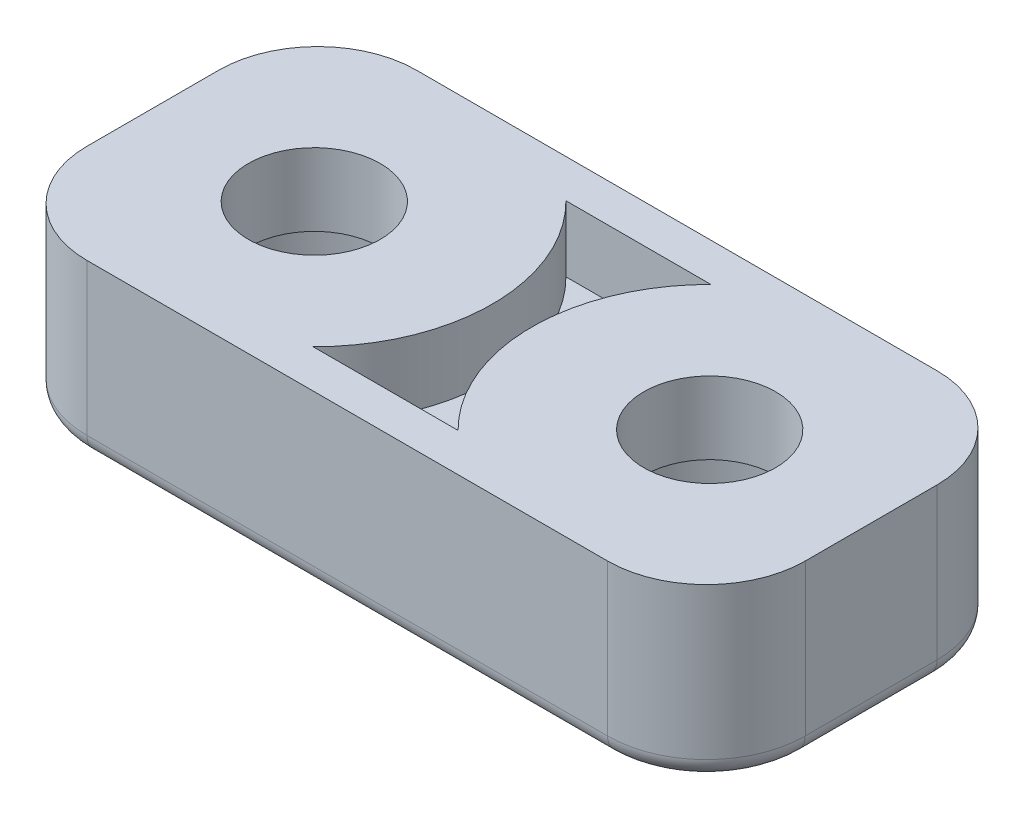
ISO-10303-21;
HEADER;
FILE_DESCRIPTION(('STEP AP214'),'2;1');
FILE_NAME('part.step','',(''),(''),'','','');
FILE_SCHEMA(('AUTOMOTIVE_DESIGN { 1 0 10303 214 1 1 1 1 }'));
ENDSEC;
DATA;
#1=APPLICATION_CONTEXT('core data for automotive mechanical design processes');
#2=APPLICATION_PROTOCOL_DEFINITION('international standard','automotive_design',2000,#1);
#3=PRODUCT_CONTEXT('',#1,'mechanical');
#4=PRODUCT('Part','Part','',(#3));
#5=PRODUCT_RELATED_PRODUCT_CATEGORY('part','',(#4));
#6=PRODUCT_DEFINITION_FORMATION('','',#4);
#7=PRODUCT_DEFINITION_CONTEXT('part definition',#1,'design');
#8=PRODUCT_DEFINITION('design','',#6,#7);
#9=PRODUCT_DEFINITION_SHAPE('','',#8);
#10=(LENGTH_UNIT() NAMED_UNIT(*) SI_UNIT(.MILLI.,.METRE.));
#11=(NAMED_UNIT(*) PLANE_ANGLE_UNIT() SI_UNIT($,.RADIAN.));
#12=(NAMED_UNIT(*) SI_UNIT($,.STERADIAN.) SOLID_ANGLE_UNIT());
#13=UNCERTAINTY_MEASURE_WITH_UNIT(LENGTH_MEASURE(1.E-05),#10,'distance_accuracy_value','');
#14=(GEOMETRIC_REPRESENTATION_CONTEXT(3) GLOBAL_UNCERTAINTY_ASSIGNED_CONTEXT((#13)) GLOBAL_UNIT_ASSIGNED_CONTEXT((#10,
#11,#12)) REPRESENTATION_CONTEXT('',''));
#15=CARTESIAN_POINT('',(0.,0.,0.));
#16=DIRECTION('',(0.,0.,1.));
#17=DIRECTION('',(1.,0.,0.));
#18=AXIS2_PLACEMENT_3D('',#15,#16,#17);
#19=CARTESIAN_POINT('',(0.,-0.3,-2.5));
#20=DIRECTION('',(0.,-1.,0.));
#21=DIRECTION('',(0.,0.,-1.));
#22=AXIS2_PLACEMENT_3D('',#19,#20,#21);
#23=PLANE('',#22);
#24=CARTESIAN_POINT('',(-3.,-0.3,0.));
#25=DIRECTION('',(0.,-1.,0.));
#26=DIRECTION('',(0.,0.,-1.));
#27=AXIS2_PLACEMENT_3D('',#24,#25,#26);
#28=CIRCLE('',#27,2.7);
#29=CARTESIAN_POINT('',(-1.09999999999993,-0.3,1.91833260932502));
#30=VERTEX_POINT('',#29);
#31=CARTESIAN_POINT('',(-0.34670016771568,-0.3,0.500000000000002));
#32=VERTEX_POINT('',#31);
#33=EDGE_CURVE('E141',#30,#32,#28,.F.);
#34=ORIENTED_EDGE('',*,*,#33,.T.);
#35=DIRECTION('',(1.,0.,0.));
#36=VECTOR('',#35,1.);
#37=CARTESIAN_POINT('',(0.,-0.3,0.5));
#38=LINE('',#37,#36);
#39=CARTESIAN_POINT('',(0.34670016771569,-0.3,0.5));
#40=VERTEX_POINT('',#39);
#41=EDGE_CURVE('E144',#32,#40,#38,.T.);
#42=ORIENTED_EDGE('',*,*,#41,.T.);
#43=CARTESIAN_POINT('',(3.,-0.3,0.));
#44=DIRECTION('',(0.,-1.,0.));
#45=DIRECTION('',(0.,0.,-1.));
#46=AXIS2_PLACEMENT_3D('',#43,#44,#45);
#47=CIRCLE('',#46,2.7);
#48=CARTESIAN_POINT('',(1.09999999999993,-0.3,1.91833260932502));
#49=VERTEX_POINT('',#48);
#50=EDGE_CURVE('E20',#40,#49,#47,.F.);
#51=ORIENTED_EDGE('',*,*,#50,.T.);
#52=DIRECTION('',(1.,0.,0.));
#53=VECTOR('',#52,1.);
#54=CARTESIAN_POINT('',(1.1,-0.3,1.918332609325));
#55=LINE('',#54,#53);
#56=EDGE_CURVE('E158',#49,#30,#55,.F.);
#57=ORIENTED_EDGE('',*,*,#56,.T.);
#58=EDGE_LOOP('',(#34,#42,#51,#57));
#59=FACE_BOUND('',#58,.T.);
#60=ADVANCED_FACE('F17',(#59),#23,.T.);
#61=CARTESIAN_POINT('',(0.,-0.3,-2.5));
#62=DIRECTION('',(0.,-1.,0.));
#63=DIRECTION('',(0.,0.,-1.));
#64=AXIS2_PLACEMENT_3D('',#61,#62,#63);
#65=PLANE('',#64);
#66=CARTESIAN_POINT('',(3.,-0.3,0.));
#67=DIRECTION('',(0.,-1.,0.));
#68=DIRECTION('',(0.,0.,-1.));
#69=AXIS2_PLACEMENT_3D('',#66,#67,#68);
#70=CIRCLE('',#69,2.7);
#71=CARTESIAN_POINT('',(1.09999999999993,-0.3,-1.91833260932502));
#72=VERTEX_POINT('',#71);
#73=CARTESIAN_POINT('',(0.34670016771568,-0.3,-0.500000000000002));
#74=VERTEX_POINT('',#73);
#75=EDGE_CURVE('E154',#72,#74,#70,.F.);
#76=ORIENTED_EDGE('',*,*,#75,.T.);
#77=DIRECTION('',(1.,0.,0.));
#78=VECTOR('',#77,1.);
#79=CARTESIAN_POINT('',(0.,-0.3,-0.5));
#80=LINE('',#79,#78);
#81=CARTESIAN_POINT('',(-0.34670016771569,-0.3,-0.5));
#82=VERTEX_POINT('',#81);
#83=EDGE_CURVE('E232',#74,#82,#80,.F.);
#84=ORIENTED_EDGE('',*,*,#83,.T.);
#85=CARTESIAN_POINT('',(-3.,-0.3,0.));
#86=DIRECTION('',(0.,-1.,0.));
#87=DIRECTION('',(0.,0.,-1.));
#88=AXIS2_PLACEMENT_3D('',#85,#86,#87);
#89=CIRCLE('',#88,2.7);
#90=CARTESIAN_POINT('',(-1.09999999999993,-0.3,-1.91833260932502));
#91=VERTEX_POINT('',#90);
#92=EDGE_CURVE('E152',#82,#91,#89,.F.);
#93=ORIENTED_EDGE('',*,*,#92,.T.);
#94=DIRECTION('',(-1.,0.,0.));
#95=VECTOR('',#94,1.);
#96=CARTESIAN_POINT('',(-1.1,-0.3,-1.918332609325));
#97=LINE('',#96,#95);
#98=EDGE_CURVE('E237',#91,#72,#97,.F.);
#99=ORIENTED_EDGE('',*,*,#98,.T.);
#100=EDGE_LOOP('',(#76,#84,#93,#99));
#101=FACE_BOUND('',#100,.T.);
#102=ADVANCED_FACE('F693',(#101),#65,.T.);
#103=CARTESIAN_POINT('',(1.1,-1.3,1.918332609325));
#104=DIRECTION('',(0.,0.,1.));
#105=DIRECTION('',(1.,0.,0.));
#106=AXIS2_PLACEMENT_3D('',#103,#104,#105);
#107=PLANE('',#106);
#108=ORIENTED_EDGE('',*,*,#56,.F.);
#109=DIRECTION('',(0.,-1.,0.));
#110=VECTOR('',#109,1.);
#111=CARTESIAN_POINT('',(1.09999999999996,-1.3,1.91833260932504));
#112=LINE('',#111,#110);
#113=CARTESIAN_POINT('',(1.09999999999993,-1.3,1.91833260932502));
#114=VERTEX_POINT('',#113);
#115=EDGE_CURVE('E136',#114,#49,#112,.F.);
#116=ORIENTED_EDGE('',*,*,#115,.F.);
#117=DIRECTION('',(1.,0.,0.));
#118=VECTOR('',#117,1.);
#119=CARTESIAN_POINT('',(-5.45,-1.3,1.918332609325));
#120=LINE('',#119,#118);
#121=CARTESIAN_POINT('',(-1.09999999999993,-1.3,1.91833260932502));
#122=VERTEX_POINT('',#121);
#123=EDGE_CURVE('E230',#122,#114,#120,.T.);
#124=ORIENTED_EDGE('',*,*,#123,.F.);
#125=DIRECTION('',(0.,-1.,0.));
#126=VECTOR('',#125,1.);
#127=CARTESIAN_POINT('',(-1.09999999999996,-1.3,1.91833260932504));
#128=LINE('',#127,#126);
#129=EDGE_CURVE('E149',#30,#122,#128,.T.);
#130=ORIENTED_EDGE('',*,*,#129,.F.);
#131=EDGE_LOOP('',(#108,#116,#124,#130));
#132=FACE_BOUND('',#131,.T.);
#133=ADVANCED_FACE('F674',(#132),#107,.F.);
#134=CARTESIAN_POINT('',(3.,-1.3,0.));
#135=DIRECTION('',(0.,-1.,0.));
#136=DIRECTION('',(0.,0.,-1.));
#137=AXIS2_PLACEMENT_3D('',#134,#135,#136);
#138=CYLINDRICAL_SURFACE('',#137,2.7);
#139=ORIENTED_EDGE('',*,*,#50,.F.);
#140=DIRECTION('',(0.,1.,0.));
#141=VECTOR('',#140,1.);
#142=CARTESIAN_POINT('',(0.3467001677157,-1.3,0.5));
#143=LINE('',#142,#141);
#144=CARTESIAN_POINT('',(0.34670016771569,-1.3,0.5));
#145=VERTEX_POINT('',#144);
#146=EDGE_CURVE('E134',#145,#40,#143,.T.);
#147=ORIENTED_EDGE('',*,*,#146,.F.);
#148=CARTESIAN_POINT('',(3.,-1.3,0.));
#149=DIRECTION('',(0.,-1.,0.));
#150=DIRECTION('',(0.,0.,-1.));
#151=AXIS2_PLACEMENT_3D('',#148,#149,#150);
#152=CIRCLE('',#151,2.7);
#153=EDGE_CURVE('E228',#114,#145,#152,.T.);
#154=ORIENTED_EDGE('',*,*,#153,.F.);
#155=ORIENTED_EDGE('',*,*,#115,.T.);
#156=EDGE_LOOP('',(#139,#147,#154,#155));
#157=FACE_BOUND('',#156,.T.);
#158=ADVANCED_FACE('F132',(#157),#138,.T.);
#159=CARTESIAN_POINT('',(0.784290103981,-1.3,0.5));
#160=DIRECTION('',(0.,0.,1.));
#161=DIRECTION('',(1.,0.,0.));
#162=AXIS2_PLACEMENT_3D('',#159,#160,#161);
#163=PLANE('',#162);
#164=ORIENTED_EDGE('',*,*,#146,.T.);
#165=ORIENTED_EDGE('',*,*,#41,.F.);
#166=DIRECTION('',(0.,-1.,0.));
#167=VECTOR('',#166,1.);
#168=CARTESIAN_POINT('',(-0.34670016771568,-1.3,0.500000000000004));
#169=LINE('',#168,#167);
#170=CARTESIAN_POINT('',(-0.34670016771568,-1.3,0.500000000000002));
#171=VERTEX_POINT('',#170);
#172=EDGE_CURVE('E240',#171,#32,#169,.F.);
#173=ORIENTED_EDGE('',*,*,#172,.F.);
#174=DIRECTION('',(1.,0.,0.));
#175=VECTOR('',#174,1.);
#176=CARTESIAN_POINT('',(-5.45,-1.3,0.5));
#177=LINE('',#176,#175);
#178=EDGE_CURVE('E147',#145,#171,#177,.F.);
#179=ORIENTED_EDGE('',*,*,#178,.F.);
#180=EDGE_LOOP('',(#164,#165,#173,#179));
#181=FACE_BOUND('',#180,.T.);
#182=ADVANCED_FACE('F143',(#181),#163,.T.);
#183=CARTESIAN_POINT('',(-3.,-1.3,0.));
#184=DIRECTION('',(0.,-1.,0.));
#185=DIRECTION('',(0.,0.,-1.));
#186=AXIS2_PLACEMENT_3D('',#183,#184,#185);
#187=CYLINDRICAL_SURFACE('',#186,2.7);
#188=CARTESIAN_POINT('',(-3.,-1.3,0.));
#189=DIRECTION('',(0.,-1.,0.));
#190=DIRECTION('',(0.,0.,-1.));
#191=AXIS2_PLACEMENT_3D('',#188,#189,#190);
#192=CIRCLE('',#191,2.7);
#193=EDGE_CURVE('E225',#171,#122,#192,.T.);
#194=ORIENTED_EDGE('',*,*,#193,.F.);
#195=ORIENTED_EDGE('',*,*,#172,.T.);
#196=ORIENTED_EDGE('',*,*,#33,.F.);
#197=ORIENTED_EDGE('',*,*,#129,.T.);
#198=EDGE_LOOP('',(#194,#195,#196,#197));
#199=FACE_BOUND('',#198,.T.);
#200=ADVANCED_FACE('F676',(#199),#187,.T.);
#201=CARTESIAN_POINT('',(-1.1,-1.3,-1.918332609325));
#202=DIRECTION('',(0.,0.,-1.));
#203=DIRECTION('',(-1.,0.,0.));
#204=AXIS2_PLACEMENT_3D('',#201,#202,#203);
#205=PLANE('',#204);
#206=ORIENTED_EDGE('',*,*,#98,.F.);
#207=DIRECTION('',(0.,-1.,0.));
#208=VECTOR('',#207,1.);
#209=CARTESIAN_POINT('',(-1.09999999999996,-1.3,-1.91833260932504));
#210=LINE('',#209,#208);
#211=CARTESIAN_POINT('',(-1.09999999999993,-1.3,-1.91833260932502));
#212=VERTEX_POINT('',#211);
#213=EDGE_CURVE('E239',#212,#91,#210,.F.);
#214=ORIENTED_EDGE('',*,*,#213,.F.);
#215=DIRECTION('',(1.,0.,0.));
#216=VECTOR('',#215,1.);
#217=CARTESIAN_POINT('',(-5.45,-1.3,-1.918332609325));
#218=LINE('',#217,#216);
#219=CARTESIAN_POINT('',(1.09999999999993,-1.3,-1.91833260932502));
#220=VERTEX_POINT('',#219);
#221=EDGE_CURVE('E224',#220,#212,#218,.F.);
#222=ORIENTED_EDGE('',*,*,#221,.F.);
#223=DIRECTION('',(0.,-1.,0.));
#224=VECTOR('',#223,1.);
#225=CARTESIAN_POINT('',(1.09999999999996,-1.3,-1.91833260932504));
#226=LINE('',#225,#224);
#227=EDGE_CURVE('E250',#72,#220,#226,.T.);
#228=ORIENTED_EDGE('',*,*,#227,.F.);
#229=EDGE_LOOP('',(#206,#214,#222,#228));
#230=FACE_BOUND('',#229,.T.);
#231=ADVANCED_FACE('F678',(#230),#205,.F.);
#232=CARTESIAN_POINT('',(-3.,-1.3,0.));
#233=DIRECTION('',(0.,-1.,0.));
#234=DIRECTION('',(0.,0.,-1.));
#235=AXIS2_PLACEMENT_3D('',#232,#233,#234);
#236=CYLINDRICAL_SURFACE('',#235,2.7);
#237=ORIENTED_EDGE('',*,*,#92,.F.);
#238=DIRECTION('',(0.,1.,0.));
#239=VECTOR('',#238,1.);
#240=CARTESIAN_POINT('',(-0.3467001677157,-1.3,-0.5));
#241=LINE('',#240,#239);
#242=CARTESIAN_POINT('',(-0.34670016771569,-1.3,-0.5));
#243=VERTEX_POINT('',#242);
#244=EDGE_CURVE('E247',#243,#82,#241,.T.);
#245=ORIENTED_EDGE('',*,*,#244,.F.);
#246=CARTESIAN_POINT('',(-3.,-1.3,0.));
#247=DIRECTION('',(0.,-1.,0.));
#248=DIRECTION('',(0.,0.,-1.));
#249=AXIS2_PLACEMENT_3D('',#246,#247,#248);
#250=CIRCLE('',#249,2.7);
#251=EDGE_CURVE('E221',#212,#243,#250,.T.);
#252=ORIENTED_EDGE('',*,*,#251,.F.);
#253=ORIENTED_EDGE('',*,*,#213,.T.);
#254=EDGE_LOOP('',(#237,#245,#252,#253));
#255=FACE_BOUND('',#254,.T.);
#256=ADVANCED_FACE('F684',(#255),#236,.T.);
#257=CARTESIAN_POINT('',(-0.6523534509749,-1.3,-0.5));
#258=DIRECTION('',(0.,0.,-1.));
#259=DIRECTION('',(-1.,0.,0.));
#260=AXIS2_PLACEMENT_3D('',#257,#258,#259);
#261=PLANE('',#260);
#262=ORIENTED_EDGE('',*,*,#244,.T.);
#263=ORIENTED_EDGE('',*,*,#83,.F.);
#264=DIRECTION('',(0.,-1.,0.));
#265=VECTOR('',#264,1.);
#266=CARTESIAN_POINT('',(0.34670016771568,-1.3,-0.500000000000003));
#267=LINE('',#266,#265);
#268=CARTESIAN_POINT('',(0.34670016771568,-1.3,-0.500000000000002));
#269=VERTEX_POINT('',#268);
#270=EDGE_CURVE('E251',#269,#74,#267,.F.);
#271=ORIENTED_EDGE('',*,*,#270,.F.);
#272=DIRECTION('',(1.,0.,0.));
#273=VECTOR('',#272,1.);
#274=CARTESIAN_POINT('',(-5.45,-1.3,-0.5));
#275=LINE('',#274,#273);
#276=EDGE_CURVE('E220',#243,#269,#275,.T.);
#277=ORIENTED_EDGE('',*,*,#276,.F.);
#278=EDGE_LOOP('',(#262,#263,#271,#277));
#279=FACE_BOUND('',#278,.T.);
#280=ADVANCED_FACE('F746',(#279),#261,.T.);
#281=CARTESIAN_POINT('',(3.,-1.3,0.));
#282=DIRECTION('',(0.,-1.,0.));
#283=DIRECTION('',(0.,0.,-1.));
#284=AXIS2_PLACEMENT_3D('',#281,#282,#283);
#285=CYLINDRICAL_SURFACE('',#284,2.7);
#286=CARTESIAN_POINT('',(3.,-1.3,0.));
#287=DIRECTION('',(0.,-1.,0.));
#288=DIRECTION('',(0.,0.,-1.));
#289=AXIS2_PLACEMENT_3D('',#286,#287,#288);
#290=CIRCLE('',#289,2.7);
#291=EDGE_CURVE('E217',#269,#220,#290,.T.);
#292=ORIENTED_EDGE('',*,*,#291,.F.);
#293=ORIENTED_EDGE('',*,*,#270,.T.);
#294=ORIENTED_EDGE('',*,*,#75,.F.);
#295=ORIENTED_EDGE('',*,*,#227,.T.);
#296=EDGE_LOOP('',(#292,#293,#294,#295));
#297=FACE_BOUND('',#296,.T.);
#298=ADVANCED_FACE('F315',(#297),#285,.T.);
#299=CARTESIAN_POINT('',(-5.45,-1.3,-2.5));
#300=DIRECTION('',(0.,-1.,0.));
#301=DIRECTION('',(0.,0.,-1.));
#302=AXIS2_PLACEMENT_3D('',#299,#300,#301);
#303=PLANE('',#302);
#304=ORIENTED_EDGE('',*,*,#276,.T.);
#305=ORIENTED_EDGE('',*,*,#291,.T.);
#306=ORIENTED_EDGE('',*,*,#221,.T.);
#307=ORIENTED_EDGE('',*,*,#251,.T.);
#308=EDGE_LOOP('',(#304,#305,#306,#307));
#309=FACE_BOUND('',#308,.T.);
#310=CARTESIAN_POINT('',(-3.,-1.3,0.));
#311=DIRECTION('',(0.,-1.,0.));
#312=DIRECTION('',(0.,0.,-1.));
#313=AXIS2_PLACEMENT_3D('',#310,#311,#312);
#314=CIRCLE('',#313,1.8);
#315=CARTESIAN_POINT('',(-3.,-1.3,-1.8));
#316=VERTEX_POINT('',#315);
#317=EDGE_CURVE('E210',#316,#316,#314,.F.);
#318=ORIENTED_EDGE('',*,*,#317,.T.);
#319=EDGE_LOOP('',(#318));
#320=FACE_BOUND('',#319,.T.);
#321=CARTESIAN_POINT('',(3.,-1.3,0.));
#322=DIRECTION('',(0.,-1.,0.));
#323=DIRECTION('',(0.,0.,-1.));
#324=AXIS2_PLACEMENT_3D('',#321,#322,#323);
#325=CIRCLE('',#324,1.8);
#326=CARTESIAN_POINT('',(3.,-1.3,-1.8));
#327=VERTEX_POINT('',#326);
#328=EDGE_CURVE('E214',#327,#327,#325,.F.);
#329=ORIENTED_EDGE('',*,*,#328,.T.);
#330=EDGE_LOOP('',(#329));
#331=FACE_BOUND('',#330,.T.);
#332=ORIENTED_EDGE('',*,*,#178,.T.);
#333=ORIENTED_EDGE('',*,*,#193,.T.);
#334=ORIENTED_EDGE('',*,*,#123,.T.);
#335=ORIENTED_EDGE('',*,*,#153,.T.);
#336=EDGE_LOOP('',(#332,#333,#334,#335));
#337=FACE_BOUND('',#336,.T.);
#338=CARTESIAN_POINT('',(-3.95,-1.3,1.));
#339=DIRECTION('',(0.,1.,0.));
#340=DIRECTION('',(-1.,0.,-8.6663893654008E-13));
#341=AXIS2_PLACEMENT_3D('',#338,#339,#340);
#342=CIRCLE('',#341,1.2);
#343=CARTESIAN_POINT('',(-5.15,-1.3,0.99999999999948));
#344=VERTEX_POINT('',#343);
#345=CARTESIAN_POINT('',(-3.9499999999995,-1.3,2.2));
#346=VERTEX_POINT('',#345);
#347=EDGE_CURVE('E339',#344,#346,#342,.T.);
#348=ORIENTED_EDGE('',*,*,#347,.F.);
#349=DIRECTION('',(0.,0.,-1.));
#350=VECTOR('',#349,1.);
#351=CARTESIAN_POINT('',(-5.15,-1.3,1.028320617004));
#352=LINE('',#351,#350);
#353=CARTESIAN_POINT('',(-5.15,-1.3,-0.9999999999987));
#354=VERTEX_POINT('',#353);
#355=EDGE_CURVE('E440',#354,#344,#352,.F.);
#356=ORIENTED_EDGE('',*,*,#355,.F.);
#357=CARTESIAN_POINT('',(-3.95,-1.3,-1.));
#358=DIRECTION('',(0.,1.,0.));
#359=DIRECTION('',(0.,0.,-1.));
#360=AXIS2_PLACEMENT_3D('',#357,#358,#359);
#361=CIRCLE('',#360,1.2);
#362=CARTESIAN_POINT('',(-3.95,-1.3,-2.2));
#363=VERTEX_POINT('',#362);
#364=EDGE_CURVE('E296',#363,#354,#361,.T.);
#365=ORIENTED_EDGE('',*,*,#364,.F.);
#366=DIRECTION('',(1.,0.,0.));
#367=VECTOR('',#366,1.);
#368=CARTESIAN_POINT('',(-3.968867650322,-1.3,-2.2));
#369=LINE('',#368,#367);
#370=CARTESIAN_POINT('',(3.9499999999995,-1.3,-2.2));
#371=VERTEX_POINT('',#370);
#372=EDGE_CURVE('E458',#371,#363,#369,.F.);
#373=ORIENTED_EDGE('',*,*,#372,.F.);
#374=CARTESIAN_POINT('',(3.95,-1.3,-1.));
#375=DIRECTION('',(0.,1.,0.));
#376=DIRECTION('',(1.,0.,0.));
#377=AXIS2_PLACEMENT_3D('',#374,#375,#376);
#378=CIRCLE('',#377,1.2);
#379=CARTESIAN_POINT('',(5.15,-1.3,-1.));
#380=VERTEX_POINT('',#379);
#381=EDGE_CURVE('E286',#380,#371,#378,.T.);
#382=ORIENTED_EDGE('',*,*,#381,.F.);
#383=DIRECTION('',(0.,0.,1.));
#384=VECTOR('',#383,1.);
#385=CARTESIAN_POINT('',(5.15,-1.3,-1.016405756195));
#386=LINE('',#385,#384);
#387=CARTESIAN_POINT('',(5.15,-1.3,0.99999999999935));
#388=VERTEX_POINT('',#387);
#389=EDGE_CURVE('E213',#388,#380,#386,.F.);
#390=ORIENTED_EDGE('',*,*,#389,.F.);
#391=CARTESIAN_POINT('',(3.95,-1.3,1.));
#392=DIRECTION('',(0.,1.,0.));
#393=DIRECTION('',(0.,0.,1.));
#394=AXIS2_PLACEMENT_3D('',#391,#392,#393);
#395=CIRCLE('',#394,1.2);
#396=CARTESIAN_POINT('',(3.95,-1.3,2.2));
#397=VERTEX_POINT('',#396);
#398=EDGE_CURVE('E209',#397,#388,#395,.T.);
#399=ORIENTED_EDGE('',*,*,#398,.F.);
#400=DIRECTION('',(-1.,0.,0.));
#401=VECTOR('',#400,1.);
#402=CARTESIAN_POINT('',(3.976802547121,-1.3,2.2));
#403=LINE('',#402,#401);
#404=EDGE_CURVE('E366',#346,#397,#403,.F.);
#405=ORIENTED_EDGE('',*,*,#404,.F.);
#406=EDGE_LOOP('',(#348,#356,#365,#373,#382,#390,#399,#405));
#407=FACE_BOUND('',#406,.T.);
#408=ADVANCED_FACE('F304',(#309,#320,#331,#337,#407),#303,.T.);
#409=CARTESIAN_POINT('',(3.,-1.3,0.));
#410=DIRECTION('',(0.,-1.,0.));
#411=DIRECTION('',(0.,0.,-1.));
#412=AXIS2_PLACEMENT_3D('',#409,#410,#411);
#413=CYLINDRICAL_SURFACE('',#412,1.8);
#414=CARTESIAN_POINT('',(3.,0.2,0.));
#415=DIRECTION('',(0.,-1.,0.));
#416=DIRECTION('',(0.,0.,-1.));
#417=AXIS2_PLACEMENT_3D('',#414,#415,#416);
#418=CIRCLE('',#417,1.8);
#419=CARTESIAN_POINT('',(3.,0.2,-1.8));
#420=VERTEX_POINT('',#419);
#421=EDGE_CURVE('E206',#420,#420,#418,.T.);
#422=ORIENTED_EDGE('',*,*,#421,.F.);
#423=EDGE_LOOP('',(#422));
#424=FACE_BOUND('',#423,.T.);
#425=ORIENTED_EDGE('',*,*,#328,.F.);
#426=EDGE_LOOP('',(#425));
#427=FACE_BOUND('',#426,.T.);
#428=ADVANCED_FACE('F314',(#424,#427),#413,.F.);
#429=CARTESIAN_POINT('',(-3.,-1.3,0.));
#430=DIRECTION('',(0.,-1.,0.));
#431=DIRECTION('',(0.,0.,-1.));
#432=AXIS2_PLACEMENT_3D('',#429,#430,#431);
#433=CYLINDRICAL_SURFACE('',#432,1.8);
#434=CARTESIAN_POINT('',(-3.,0.2,0.));
#435=DIRECTION('',(0.,-1.,0.));
#436=DIRECTION('',(0.,0.,-1.));
#437=AXIS2_PLACEMENT_3D('',#434,#435,#436);
#438=CIRCLE('',#437,1.8);
#439=CARTESIAN_POINT('',(-3.,0.2,-1.8));
#440=VERTEX_POINT('',#439);
#441=EDGE_CURVE('E202',#440,#440,#438,.T.);
#442=ORIENTED_EDGE('',*,*,#441,.F.);
#443=EDGE_LOOP('',(#442));
#444=FACE_BOUND('',#443,.T.);
#445=ORIENTED_EDGE('',*,*,#317,.F.);
#446=EDGE_LOOP('',(#445));
#447=FACE_BOUND('',#446,.T.);
#448=ADVANCED_FACE('F667',(#444,#447),#433,.F.);
#449=CARTESIAN_POINT('',(5.15,-1.,-1.016405756195));
#450=DIRECTION('',(0.,0.,1.));
#451=DIRECTION('',(1.,0.,0.));
#452=AXIS2_PLACEMENT_3D('',#449,#450,#451);
#453=CYLINDRICAL_SURFACE('',#452,0.3);
#454=CARTESIAN_POINT('',(5.15,-1.,1.));
#455=DIRECTION('',(0.,0.,-1.));
#456=DIRECTION('',(1.,0.,0.));
#457=AXIS2_PLACEMENT_3D('',#454,#455,#456);
#458=CIRCLE('',#457,0.3);
#459=CARTESIAN_POINT('',(5.45,-1.,0.999999999998538));
#460=VERTEX_POINT('',#459);
#461=EDGE_CURVE('E402',#388,#460,#458,.F.);
#462=ORIENTED_EDGE('',*,*,#461,.F.);
#463=ORIENTED_EDGE('',*,*,#389,.T.);
#464=CARTESIAN_POINT('',(5.15,-1.,-0.999999999999999));
#465=DIRECTION('',(0.,0.,1.));
#466=DIRECTION('',(1.,0.,0.));
#467=AXIS2_PLACEMENT_3D('',#464,#465,#466);
#468=CIRCLE('',#467,0.3);
#469=CARTESIAN_POINT('',(5.45,-1.,-1.));
#470=VERTEX_POINT('',#469);
#471=EDGE_CURVE('E283',#470,#380,#468,.F.);
#472=ORIENTED_EDGE('',*,*,#471,.F.);
#473=DIRECTION('',(0.,0.,-1.));
#474=VECTOR('',#473,1.);
#475=CARTESIAN_POINT('',(5.45,-1.,-2.5));
#476=LINE('',#475,#474);
#477=EDGE_CURVE('E205',#460,#470,#476,.T.);
#478=ORIENTED_EDGE('',*,*,#477,.F.);
#479=EDGE_LOOP('',(#462,#463,#472,#478));
#480=FACE_BOUND('',#479,.T.);
#481=ADVANCED_FACE('F274',(#480),#453,.T.);
#482=CARTESIAN_POINT('',(3.95,-1.,-1.));
#483=DIRECTION('',(0.,-1.,0.));
#484=DIRECTION('',(-0.0125781018635596,0.,-0.999920892547761));
#485=AXIS2_PLACEMENT_3D('',#482,#483,#484);
#486=TOROIDAL_SURFACE('',#485,1.2,0.3);
#487=ORIENTED_EDGE('',*,*,#471,.T.);
#488=ORIENTED_EDGE('',*,*,#381,.T.);
#489=CARTESIAN_POINT('',(3.949999999999,-1.,-2.2));
#490=DIRECTION('',(1.,0.,0.));
#491=DIRECTION('',(0.,0.,-1.));
#492=AXIS2_PLACEMENT_3D('',#489,#490,#491);
#493=CIRCLE('',#492,0.3);
#494=CARTESIAN_POINT('',(3.949999999999,-1.,-2.5));
#495=VERTEX_POINT('',#494);
#496=EDGE_CURVE('E487',#495,#371,#493,.F.);
#497=ORIENTED_EDGE('',*,*,#496,.F.);
#498=CARTESIAN_POINT('',(3.95,-1.,-1.));
#499=DIRECTION('',(0.,-1.,0.));
#500=DIRECTION('',(0.,0.,-1.));
#501=AXIS2_PLACEMENT_3D('',#498,#499,#500);
#502=CIRCLE('',#501,1.5);
#503=EDGE_CURVE('E481',#470,#495,#502,.F.);
#504=ORIENTED_EDGE('',*,*,#503,.F.);
#505=EDGE_LOOP('',(#487,#488,#497,#504));
#506=FACE_BOUND('',#505,.T.);
#507=ADVANCED_FACE('F262',(#506),#486,.T.);
#508=CARTESIAN_POINT('',(-3.968867650322,-1.,-2.2));
#509=DIRECTION('',(1.,0.,0.));
#510=DIRECTION('',(0.,0.,-1.));
#511=AXIS2_PLACEMENT_3D('',#508,#509,#510);
#512=CYLINDRICAL_SURFACE('',#511,0.3);
#513=ORIENTED_EDGE('',*,*,#496,.T.);
#514=ORIENTED_EDGE('',*,*,#372,.T.);
#515=CARTESIAN_POINT('',(-3.95,-1.,-2.2));
#516=DIRECTION('',(-1.,0.,0.));
#517=DIRECTION('',(0.,0.,-1.));
#518=AXIS2_PLACEMENT_3D('',#515,#516,#517);
#519=CIRCLE('',#518,0.3);
#520=CARTESIAN_POINT('',(-3.95,-1.,-2.5));
#521=VERTEX_POINT('',#520);
#522=EDGE_CURVE('E473',#521,#363,#519,.T.);
#523=ORIENTED_EDGE('',*,*,#522,.F.);
#524=DIRECTION('',(1.,0.,0.));
#525=VECTOR('',#524,1.);
#526=CARTESIAN_POINT('',(0.,-1.,-2.5));
#527=LINE('',#526,#525);
#528=EDGE_CURVE('E477',#521,#495,#527,.T.);
#529=ORIENTED_EDGE('',*,*,#528,.T.);
#530=EDGE_LOOP('',(#513,#514,#523,#529));
#531=FACE_BOUND('',#530,.T.);
#532=ADVANCED_FACE('F273',(#531),#512,.T.);
#533=CARTESIAN_POINT('',(-3.95,-1.,-1.));
#534=DIRECTION('',(0.,1.,0.));
#535=DIRECTION('',(-0.99984036501803,0.,0.0178674139318905));
#536=AXIS2_PLACEMENT_3D('',#533,#534,#535);
#537=TOROIDAL_SURFACE('',#536,1.2,0.3);
#538=ORIENTED_EDGE('',*,*,#522,.T.);
#539=ORIENTED_EDGE('',*,*,#364,.T.);
#540=CARTESIAN_POINT('',(-5.15,-1.,-0.9999999999974));
#541=DIRECTION('',(0.,0.,-1.));
#542=DIRECTION('',(-1.,0.,0.));
#543=AXIS2_PLACEMENT_3D('',#540,#541,#542);
#544=CIRCLE('',#543,0.3);
#545=CARTESIAN_POINT('',(-5.45,-1.,-0.9999999999987));
#546=VERTEX_POINT('',#545);
#547=EDGE_CURVE('E448',#546,#354,#544,.F.);
#548=ORIENTED_EDGE('',*,*,#547,.F.);
#549=CARTESIAN_POINT('',(-3.95,-1.,-1.));
#550=DIRECTION('',(0.,1.,0.));
#551=DIRECTION('',(0.,0.,1.));
#552=AXIS2_PLACEMENT_3D('',#549,#550,#551);
#553=CIRCLE('',#552,1.5);
#554=EDGE_CURVE('E527',#521,#546,#553,.T.);
#555=ORIENTED_EDGE('',*,*,#554,.F.);
#556=EDGE_LOOP('',(#538,#539,#548,#555));
#557=FACE_BOUND('',#556,.T.);
#558=ADVANCED_FACE('F459',(#557),#537,.T.);
#559=CARTESIAN_POINT('',(-5.15,-1.,1.028320617004));
#560=DIRECTION('',(0.,0.,-1.));
#561=DIRECTION('',(-1.,0.,0.));
#562=AXIS2_PLACEMENT_3D('',#559,#560,#561);
#563=CYLINDRICAL_SURFACE('',#562,0.3);
#564=ORIENTED_EDGE('',*,*,#547,.T.);
#565=ORIENTED_EDGE('',*,*,#355,.T.);
#566=CARTESIAN_POINT('',(-5.15,-1.,0.99999999999896));
#567=DIRECTION('',(8.66747645877908E-13,0.,-1.));
#568=DIRECTION('',(-1.,0.,-8.66634888851969E-13));
#569=AXIS2_PLACEMENT_3D('',#566,#567,#568);
#570=CIRCLE('',#569,0.3);
#571=CARTESIAN_POINT('',(-5.45,-1.,0.99999999999935));
#572=VERTEX_POINT('',#571);
#573=EDGE_CURVE('E426',#572,#344,#570,.F.);
#574=ORIENTED_EDGE('',*,*,#573,.F.);
#575=DIRECTION('',(0.,0.,1.));
#576=VECTOR('',#575,1.);
#577=CARTESIAN_POINT('',(-5.45,-1.,-2.5));
#578=LINE('',#577,#576);
#579=EDGE_CURVE('E540',#546,#572,#578,.T.);
#580=ORIENTED_EDGE('',*,*,#579,.F.);
#581=EDGE_LOOP('',(#564,#565,#574,#580));
#582=FACE_BOUND('',#581,.T.);
#583=ADVANCED_FACE('F432',(#582),#563,.T.);
#584=CARTESIAN_POINT('',(-3.95,-1.,1.));
#585=DIRECTION('',(0.,-1.,0.));
#586=DIRECTION('',(0.0125781018635596,0.,0.999920892547761));
#587=AXIS2_PLACEMENT_3D('',#584,#585,#586);
#588=TOROIDAL_SURFACE('',#587,1.2,0.3);
#589=ORIENTED_EDGE('',*,*,#573,.T.);
#590=ORIENTED_EDGE('',*,*,#347,.T.);
#591=CARTESIAN_POINT('',(-3.949999999999,-1.,2.2));
#592=DIRECTION('',(-1.,0.,0.));
#593=DIRECTION('',(0.,0.,1.));
#594=AXIS2_PLACEMENT_3D('',#591,#592,#593);
#595=CIRCLE('',#594,0.3);
#596=CARTESIAN_POINT('',(-3.9499999999995,-1.,2.5));
#597=VERTEX_POINT('',#596);
#598=EDGE_CURVE('E413',#597,#346,#595,.F.);
#599=ORIENTED_EDGE('',*,*,#598,.F.);
#600=CARTESIAN_POINT('',(-3.95,-1.,1.));
#601=DIRECTION('',(0.,-1.,0.));
#602=DIRECTION('',(0.,0.,-1.));
#603=AXIS2_PLACEMENT_3D('',#600,#601,#602);
#604=CIRCLE('',#603,1.5);
#605=EDGE_CURVE('E418',#572,#597,#604,.F.);
#606=ORIENTED_EDGE('',*,*,#605,.F.);
#607=EDGE_LOOP('',(#589,#590,#599,#606));
#608=FACE_BOUND('',#607,.T.);
#609=ADVANCED_FACE('F428',(#608),#588,.T.);
#610=CARTESIAN_POINT('',(3.976802547121,-1.,2.2));
#611=DIRECTION('',(-1.,0.,0.));
#612=DIRECTION('',(0.,0.,1.));
#613=AXIS2_PLACEMENT_3D('',#610,#611,#612);
#614=CYLINDRICAL_SURFACE('',#613,0.3);
#615=ORIENTED_EDGE('',*,*,#598,.T.);
#616=ORIENTED_EDGE('',*,*,#404,.T.);
#617=CARTESIAN_POINT('',(3.95,-1.,2.2));
#618=DIRECTION('',(1.,0.,0.));
#619=DIRECTION('',(0.,0.,1.));
#620=AXIS2_PLACEMENT_3D('',#617,#618,#619);
#621=CIRCLE('',#620,0.3);
#622=CARTESIAN_POINT('',(3.95,-1.,2.5));
#623=VERTEX_POINT('',#622);
#624=EDGE_CURVE('E400',#623,#397,#621,.T.);
#625=ORIENTED_EDGE('',*,*,#624,.F.);
#626=DIRECTION('',(1.,0.,0.));
#627=VECTOR('',#626,1.);
#628=CARTESIAN_POINT('',(0.,-1.,2.5));
#629=LINE('',#628,#627);
#630=EDGE_CURVE('E388',#597,#623,#629,.T.);
#631=ORIENTED_EDGE('',*,*,#630,.F.);
#632=EDGE_LOOP('',(#615,#616,#625,#631));
#633=FACE_BOUND('',#632,.T.);
#634=ADVANCED_FACE('F380',(#633),#614,.T.);
#635=CARTESIAN_POINT('',(3.95,-1.,1.));
#636=DIRECTION('',(0.,1.,0.));
#637=DIRECTION('',(0.99984036501803,0.,-0.0178674139318905));
#638=AXIS2_PLACEMENT_3D('',#635,#636,#637);
#639=TOROIDAL_SURFACE('',#638,1.2,0.3);
#640=ORIENTED_EDGE('',*,*,#624,.T.);
#641=ORIENTED_EDGE('',*,*,#398,.T.);
#642=ORIENTED_EDGE('',*,*,#461,.T.);
#643=CARTESIAN_POINT('',(3.95,-1.,1.));
#644=DIRECTION('',(0.,1.,0.));
#645=DIRECTION('',(0.,0.,1.));
#646=AXIS2_PLACEMENT_3D('',#643,#644,#645);
#647=CIRCLE('',#646,1.5);
#648=EDGE_CURVE('E201',#623,#460,#647,.T.);
#649=ORIENTED_EDGE('',*,*,#648,.F.);
#650=EDGE_LOOP('',(#640,#641,#642,#649));
#651=FACE_BOUND('',#650,.T.);
#652=ADVANCED_FACE('F368',(#651),#639,.T.);
#653=CARTESIAN_POINT('',(0.,0.2,-2.5));
#654=DIRECTION('',(0.,-1.,0.));
#655=DIRECTION('',(0.,0.,-1.));
#656=AXIS2_PLACEMENT_3D('',#653,#654,#655);
#657=PLANE('',#656);
#658=CARTESIAN_POINT('',(3.,0.2,0.));
#659=DIRECTION('',(0.,-1.,0.));
#660=DIRECTION('',(0.,0.,-1.));
#661=AXIS2_PLACEMENT_3D('',#658,#659,#660);
#662=CIRCLE('',#661,1.);
#663=CARTESIAN_POINT('',(3.,0.2,-1.));
#664=VERTEX_POINT('',#663);
#665=EDGE_CURVE('E198',#664,#664,#662,.F.);
#666=ORIENTED_EDGE('',*,*,#665,.T.);
#667=EDGE_LOOP('',(#666));
#668=FACE_BOUND('',#667,.T.);
#669=ORIENTED_EDGE('',*,*,#421,.T.);
#670=EDGE_LOOP('',(#669));
#671=FACE_BOUND('',#670,.T.);
#672=ADVANCED_FACE('F379',(#668,#671),#657,.T.);
#673=CARTESIAN_POINT('',(0.,0.2,-2.5));
#674=DIRECTION('',(0.,-1.,0.));
#675=DIRECTION('',(0.,0.,-1.));
#676=AXIS2_PLACEMENT_3D('',#673,#674,#675);
#677=PLANE('',#676);
#678=CARTESIAN_POINT('',(-3.,0.2,0.));
#679=DIRECTION('',(0.,-1.,0.));
#680=DIRECTION('',(0.,0.,-1.));
#681=AXIS2_PLACEMENT_3D('',#678,#679,#680);
#682=CIRCLE('',#681,1.);
#683=CARTESIAN_POINT('',(-3.,0.2,-1.));
#684=VERTEX_POINT('',#683);
#685=EDGE_CURVE('E195',#684,#684,#682,.F.);
#686=ORIENTED_EDGE('',*,*,#685,.T.);
#687=EDGE_LOOP('',(#686));
#688=FACE_BOUND('',#687,.T.);
#689=ORIENTED_EDGE('',*,*,#441,.T.);
#690=EDGE_LOOP('',(#689));
#691=FACE_BOUND('',#690,.T.);
#692=ADVANCED_FACE('F662',(#688,#691),#677,.T.);
#693=CARTESIAN_POINT('',(0.,0.3,-2.5));
#694=DIRECTION('',(0.,-1.,0.));
#695=DIRECTION('',(0.,0.,-1.));
#696=AXIS2_PLACEMENT_3D('',#693,#694,#695);
#697=PLANE('',#696);
#698=DIRECTION('',(1.,0.,0.));
#699=VECTOR('',#698,1.);
#700=CARTESIAN_POINT('',(-1.1,0.3,-1.918332609325));
#701=LINE('',#700,#699);
#702=CARTESIAN_POINT('',(-1.09999999999996,0.3,-1.918332609325));
#703=VERTEX_POINT('',#702);
#704=CARTESIAN_POINT('',(1.09999999999993,0.3,-1.91833260932502));
#705=VERTEX_POINT('',#704);
#706=EDGE_CURVE('E386',#703,#705,#701,.T.);
#707=ORIENTED_EDGE('',*,*,#706,.F.);
#708=CARTESIAN_POINT('',(-3.,0.3,0.));
#709=DIRECTION('',(0.,-1.,0.));
#710=DIRECTION('',(0.,0.,-1.));
#711=AXIS2_PLACEMENT_3D('',#708,#709,#710);
#712=CIRCLE('',#711,2.7);
#713=CARTESIAN_POINT('',(-1.09999999999996,0.3,1.918332609325));
#714=VERTEX_POINT('',#713);
#715=EDGE_CURVE('E192',#714,#703,#712,.F.);
#716=ORIENTED_EDGE('',*,*,#715,.F.);
#717=DIRECTION('',(-1.,0.,0.));
#718=VECTOR('',#717,1.);
#719=CARTESIAN_POINT('',(1.1,0.3,1.918332609325));
#720=LINE('',#719,#718);
#721=CARTESIAN_POINT('',(1.09999999999996,0.3,1.918332609325));
#722=VERTEX_POINT('',#721);
#723=EDGE_CURVE('E190',#722,#714,#720,.T.);
#724=ORIENTED_EDGE('',*,*,#723,.F.);
#725=CARTESIAN_POINT('',(3.,0.3,0.));
#726=DIRECTION('',(0.,-1.,0.));
#727=DIRECTION('',(0.,0.,-1.));
#728=AXIS2_PLACEMENT_3D('',#725,#726,#727);
#729=CIRCLE('',#728,2.7);
#730=EDGE_CURVE('E188',#705,#722,#729,.F.);
#731=ORIENTED_EDGE('',*,*,#730,.F.);
#732=EDGE_LOOP('',(#707,#716,#724,#731));
#733=FACE_BOUND('',#732,.T.);
#734=ADVANCED_FACE('F850',(#733),#697,.F.);
#735=CARTESIAN_POINT('',(5.45,-1.3,-2.5));
#736=DIRECTION('',(1.,0.,0.));
#737=DIRECTION('',(0.,0.,-1.));
#738=AXIS2_PLACEMENT_3D('',#735,#736,#737);
#739=PLANE('',#738);
#740=DIRECTION('',(0.,1.,0.));
#741=VECTOR('',#740,1.);
#742=CARTESIAN_POINT('',(5.45,-1.318503961417,0.9999999999974));
#743=LINE('',#742,#741);
#744=CARTESIAN_POINT('',(5.45,1.3,0.9999999999987));
#745=VERTEX_POINT('',#744);
#746=EDGE_CURVE('E391',#460,#745,#743,.T.);
#747=ORIENTED_EDGE('',*,*,#746,.F.);
#748=ORIENTED_EDGE('',*,*,#477,.T.);
#749=DIRECTION('',(0.,-1.,0.));
#750=VECTOR('',#749,1.);
#751=CARTESIAN_POINT('',(5.45,1.319200418308,-1.));
#752=LINE('',#751,#750);
#753=CARTESIAN_POINT('',(5.45,1.3,-1.));
#754=VERTEX_POINT('',#753);
#755=EDGE_CURVE('E407',#754,#470,#752,.T.);
#756=ORIENTED_EDGE('',*,*,#755,.F.);
#757=DIRECTION('',(0.,0.,1.));
#758=VECTOR('',#757,1.);
#759=CARTESIAN_POINT('',(5.45,1.3,-2.5));
#760=LINE('',#759,#758);
#761=EDGE_CURVE('E187',#745,#754,#760,.F.);
#762=ORIENTED_EDGE('',*,*,#761,.F.);
#763=EDGE_LOOP('',(#747,#748,#756,#762));
#764=FACE_BOUND('',#763,.T.);
#765=ADVANCED_FACE('F605',(#764),#739,.T.);
#766=CARTESIAN_POINT('',(3.95,1.319200418308,-1.));
#767=DIRECTION('',(0.,-1.,0.));
#768=DIRECTION('',(0.,0.,-1.));
#769=AXIS2_PLACEMENT_3D('',#766,#767,#768);
#770=CYLINDRICAL_SURFACE('',#769,1.5);
#771=ORIENTED_EDGE('',*,*,#755,.T.);
#772=ORIENTED_EDGE('',*,*,#503,.T.);
#773=DIRECTION('',(0.,1.,0.));
#774=VECTOR('',#773,1.);
#775=CARTESIAN_POINT('',(3.949999999999,0.,-2.5));
#776=LINE('',#775,#774);
#777=CARTESIAN_POINT('',(3.9499999999995,1.3,-2.5));
#778=VERTEX_POINT('',#777);
#779=EDGE_CURVE('E480',#495,#778,#776,.T.);
#780=ORIENTED_EDGE('',*,*,#779,.T.);
#781=CARTESIAN_POINT('',(3.95,1.3,-1.));
#782=DIRECTION('',(0.,-1.,0.));
#783=DIRECTION('',(0.,0.,-1.));
#784=AXIS2_PLACEMENT_3D('',#781,#782,#783);
#785=CIRCLE('',#784,1.5);
#786=EDGE_CURVE('E184',#754,#778,#785,.F.);
#787=ORIENTED_EDGE('',*,*,#786,.F.);
#788=EDGE_LOOP('',(#771,#772,#780,#787));
#789=FACE_BOUND('',#788,.T.);
#790=ADVANCED_FACE('F868',(#789),#770,.T.);
#791=CARTESIAN_POINT('',(0.,0.,-2.5));
#792=DIRECTION('',(0.,0.,1.));
#793=DIRECTION('',(1.,0.,0.));
#794=AXIS2_PLACEMENT_3D('',#791,#792,#793);
#795=PLANE('',#794);
#796=DIRECTION('',(1.,0.,0.));
#797=VECTOR('',#796,1.);
#798=CARTESIAN_POINT('',(5.45,1.3,-2.5));
#799=LINE('',#798,#797);
#800=CARTESIAN_POINT('',(-3.95,1.3,-2.5));
#801=VERTEX_POINT('',#800);
#802=EDGE_CURVE('E183',#778,#801,#799,.F.);
#803=ORIENTED_EDGE('',*,*,#802,.F.);
#804=ORIENTED_EDGE('',*,*,#779,.F.);
#805=ORIENTED_EDGE('',*,*,#528,.F.);
#806=DIRECTION('',(0.,1.,0.));
#807=VECTOR('',#806,1.);
#808=CARTESIAN_POINT('',(-3.95,-1.318503961417,-2.5));
#809=LINE('',#808,#807);
#810=EDGE_CURVE('E538',#801,#521,#809,.F.);
#811=ORIENTED_EDGE('',*,*,#810,.F.);
#812=EDGE_LOOP('',(#803,#804,#805,#811));
#813=FACE_BOUND('',#812,.T.);
#814=ADVANCED_FACE('F877',(#813),#795,.F.);
#815=CARTESIAN_POINT('',(-3.95,-1.318503961417,-1.));
#816=DIRECTION('',(0.,1.,0.));
#817=DIRECTION('',(0.,0.,1.));
#818=AXIS2_PLACEMENT_3D('',#815,#816,#817);
#819=CYLINDRICAL_SURFACE('',#818,1.5);
#820=ORIENTED_EDGE('',*,*,#810,.T.);
#821=ORIENTED_EDGE('',*,*,#554,.T.);
#822=DIRECTION('',(0.,1.,0.));
#823=VECTOR('',#822,1.);
#824=CARTESIAN_POINT('',(-5.45,1.3,-1.));
#825=LINE('',#824,#823);
#826=CARTESIAN_POINT('',(-5.45,1.3,-1.));
#827=VERTEX_POINT('',#826);
#828=EDGE_CURVE('E536',#827,#546,#825,.F.);
#829=ORIENTED_EDGE('',*,*,#828,.F.);
#830=CARTESIAN_POINT('',(-3.95,1.3,-1.));
#831=DIRECTION('',(0.,1.,0.));
#832=DIRECTION('',(0.,0.,1.));
#833=AXIS2_PLACEMENT_3D('',#830,#831,#832);
#834=CIRCLE('',#833,1.5);
#835=EDGE_CURVE('E180',#801,#827,#834,.T.);
#836=ORIENTED_EDGE('',*,*,#835,.F.);
#837=EDGE_LOOP('',(#820,#821,#829,#836));
#838=FACE_BOUND('',#837,.T.);
#839=ADVANCED_FACE('F533',(#838),#819,.T.);
#840=CARTESIAN_POINT('',(-5.45,1.3,-2.5));
#841=DIRECTION('',(-1.,0.,0.));
#842=DIRECTION('',(0.,0.,1.));
#843=AXIS2_PLACEMENT_3D('',#840,#841,#842);
#844=PLANE('',#843);
#845=ORIENTED_EDGE('',*,*,#828,.T.);
#846=ORIENTED_EDGE('',*,*,#579,.T.);
#847=DIRECTION('',(0.,-1.,0.));
#848=VECTOR('',#847,1.);
#849=CARTESIAN_POINT('',(-5.45,1.318867650322,1.));
#850=LINE('',#849,#848);
#851=CARTESIAN_POINT('',(-5.45,1.3,1.));
#852=VERTEX_POINT('',#851);
#853=EDGE_CURVE('E421',#852,#572,#850,.T.);
#854=ORIENTED_EDGE('',*,*,#853,.F.);
#855=DIRECTION('',(0.,0.,1.));
#856=VECTOR('',#855,1.);
#857=CARTESIAN_POINT('',(-5.45,1.3,-2.5));
#858=LINE('',#857,#856);
#859=EDGE_CURVE('E179',#827,#852,#858,.T.);
#860=ORIENTED_EDGE('',*,*,#859,.F.);
#861=EDGE_LOOP('',(#845,#846,#854,#860));
#862=FACE_BOUND('',#861,.T.);
#863=ADVANCED_FACE('F544',(#862),#844,.T.);
#864=CARTESIAN_POINT('',(-3.95,1.318867650322,1.));
#865=DIRECTION('',(0.,-1.,0.));
#866=DIRECTION('',(0.,0.,-1.));
#867=AXIS2_PLACEMENT_3D('',#864,#865,#866);
#868=CYLINDRICAL_SURFACE('',#867,1.5);
#869=ORIENTED_EDGE('',*,*,#853,.T.);
#870=ORIENTED_EDGE('',*,*,#605,.T.);
#871=DIRECTION('',(0.,1.,0.));
#872=VECTOR('',#871,1.);
#873=CARTESIAN_POINT('',(-3.95,0.,2.5));
#874=LINE('',#873,#872);
#875=CARTESIAN_POINT('',(-3.95,1.3,2.5));
#876=VERTEX_POINT('',#875);
#877=EDGE_CURVE('E392',#876,#597,#874,.F.);
#878=ORIENTED_EDGE('',*,*,#877,.F.);
#879=CARTESIAN_POINT('',(-3.95,1.3,1.));
#880=DIRECTION('',(0.,-1.,0.));
#881=DIRECTION('',(0.,0.,-1.));
#882=AXIS2_PLACEMENT_3D('',#879,#880,#881);
#883=CIRCLE('',#882,1.5);
#884=EDGE_CURVE('E176',#852,#876,#883,.F.);
#885=ORIENTED_EDGE('',*,*,#884,.F.);
#886=EDGE_LOOP('',(#869,#870,#878,#885));
#887=FACE_BOUND('',#886,.T.);
#888=ADVANCED_FACE('F589',(#887),#868,.T.);
#889=CARTESIAN_POINT('',(0.,0.,2.5));
#890=DIRECTION('',(0.,0.,1.));
#891=DIRECTION('',(1.,0.,0.));
#892=AXIS2_PLACEMENT_3D('',#889,#890,#891);
#893=PLANE('',#892);
#894=ORIENTED_EDGE('',*,*,#877,.T.);
#895=ORIENTED_EDGE('',*,*,#630,.T.);
#896=DIRECTION('',(0.,1.,0.));
#897=VECTOR('',#896,1.);
#898=CARTESIAN_POINT('',(3.95,-1.318503961417,2.5));
#899=LINE('',#898,#897);
#900=CARTESIAN_POINT('',(3.95,1.3,2.5));
#901=VERTEX_POINT('',#900);
#902=EDGE_CURVE('E397',#901,#623,#899,.F.);
#903=ORIENTED_EDGE('',*,*,#902,.F.);
#904=DIRECTION('',(1.,0.,0.));
#905=VECTOR('',#904,1.);
#906=CARTESIAN_POINT('',(5.45,1.3,2.5));
#907=LINE('',#906,#905);
#908=EDGE_CURVE('E175',#876,#901,#907,.T.);
#909=ORIENTED_EDGE('',*,*,#908,.F.);
#910=EDGE_LOOP('',(#894,#895,#903,#909));
#911=FACE_BOUND('',#910,.T.);
#912=ADVANCED_FACE('F616',(#911),#893,.T.);
#913=CARTESIAN_POINT('',(3.95,-1.318503961417,1.));
#914=DIRECTION('',(0.,1.,0.));
#915=DIRECTION('',(0.,0.,1.));
#916=AXIS2_PLACEMENT_3D('',#913,#914,#915);
#917=CYLINDRICAL_SURFACE('',#916,1.5);
#918=ORIENTED_EDGE('',*,*,#902,.T.);
#919=ORIENTED_EDGE('',*,*,#648,.T.);
#920=ORIENTED_EDGE('',*,*,#746,.T.);
#921=CARTESIAN_POINT('',(3.95,1.3,1.));
#922=DIRECTION('',(0.,1.,0.));
#923=DIRECTION('',(0.,0.,1.));
#924=AXIS2_PLACEMENT_3D('',#921,#922,#923);
#925=CIRCLE('',#924,1.5);
#926=EDGE_CURVE('E172',#901,#745,#925,.T.);
#927=ORIENTED_EDGE('',*,*,#926,.F.);
#928=EDGE_LOOP('',(#918,#919,#920,#927));
#929=FACE_BOUND('',#928,.T.);
#930=ADVANCED_FACE('F608',(#929),#917,.T.);
#931=CARTESIAN_POINT('',(3.,-1.3,0.));
#932=DIRECTION('',(0.,-1.,0.));
#933=DIRECTION('',(0.,0.,-1.));
#934=AXIS2_PLACEMENT_3D('',#931,#932,#933);
#935=CYLINDRICAL_SURFACE('',#934,1.);
#936=CARTESIAN_POINT('',(3.,1.3,0.));
#937=DIRECTION('',(0.,-1.,0.));
#938=DIRECTION('',(0.,0.,-1.));
#939=AXIS2_PLACEMENT_3D('',#936,#937,#938);
#940=CIRCLE('',#939,1.);
#941=CARTESIAN_POINT('',(3.,1.3,-1.));
#942=VERTEX_POINT('',#941);
#943=EDGE_CURVE('E169',#942,#942,#940,.T.);
#944=ORIENTED_EDGE('',*,*,#943,.F.);
#945=EDGE_LOOP('',(#944));
#946=FACE_BOUND('',#945,.T.);
#947=ORIENTED_EDGE('',*,*,#665,.F.);
#948=EDGE_LOOP('',(#947));
#949=FACE_BOUND('',#948,.T.);
#950=ADVANCED_FACE('F624',(#946,#949),#935,.F.);
#951=CARTESIAN_POINT('',(-3.,-1.3,0.));
#952=DIRECTION('',(0.,-1.,0.));
#953=DIRECTION('',(0.,0.,-1.));
#954=AXIS2_PLACEMENT_3D('',#951,#952,#953);
#955=CYLINDRICAL_SURFACE('',#954,1.);
#956=CARTESIAN_POINT('',(-3.,1.3,0.));
#957=DIRECTION('',(0.,-1.,0.));
#958=DIRECTION('',(0.,0.,-1.));
#959=AXIS2_PLACEMENT_3D('',#956,#957,#958);
#960=CIRCLE('',#959,1.);
#961=CARTESIAN_POINT('',(-3.,1.3,-1.));
#962=VERTEX_POINT('',#961);
#963=EDGE_CURVE('E166',#962,#962,#960,.T.);
#964=ORIENTED_EDGE('',*,*,#963,.F.);
#965=EDGE_LOOP('',(#964));
#966=FACE_BOUND('',#965,.T.);
#967=ORIENTED_EDGE('',*,*,#685,.F.);
#968=EDGE_LOOP('',(#967));
#969=FACE_BOUND('',#968,.T.);
#970=ADVANCED_FACE('F647',(#966,#969),#955,.F.);
#971=CARTESIAN_POINT('',(-3.,1.3,0.));
#972=DIRECTION('',(0.,-1.,0.));
#973=DIRECTION('',(0.,0.,-1.));
#974=AXIS2_PLACEMENT_3D('',#971,#972,#973);
#975=CYLINDRICAL_SURFACE('',#974,2.7);
#976=CARTESIAN_POINT('',(-3.,1.3,0.));
#977=DIRECTION('',(0.,-1.,0.));
#978=DIRECTION('',(0.,0.,-1.));
#979=AXIS2_PLACEMENT_3D('',#976,#977,#978);
#980=CIRCLE('',#979,2.7);
#981=CARTESIAN_POINT('',(-1.09999999999996,1.3,1.918332609325));
#982=VERTEX_POINT('',#981);
#983=CARTESIAN_POINT('',(-1.09999999999996,1.3,-1.918332609325));
#984=VERTEX_POINT('',#983);
#985=EDGE_CURVE('E163',#982,#984,#980,.F.);
#986=ORIENTED_EDGE('',*,*,#985,.F.);
#987=DIRECTION('',(0.,1.,0.));
#988=VECTOR('',#987,1.);
#989=CARTESIAN_POINT('',(-1.1,1.3,1.918332609325));
#990=LINE('',#989,#988);
#991=EDGE_CURVE('E563',#714,#982,#990,.T.);
#992=ORIENTED_EDGE('',*,*,#991,.F.);
#993=ORIENTED_EDGE('',*,*,#715,.T.);
#994=DIRECTION('',(0.,1.,0.));
#995=VECTOR('',#994,1.);
#996=CARTESIAN_POINT('',(-1.1,1.3,-1.918332609325));
#997=LINE('',#996,#995);
#998=EDGE_CURVE('E194',#984,#703,#997,.F.);
#999=ORIENTED_EDGE('',*,*,#998,.F.);
#1000=EDGE_LOOP('',(#986,#992,#993,#999));
#1001=FACE_BOUND('',#1000,.T.);
#1002=ADVANCED_FACE('F643',(#1001),#975,.T.);
#1003=CARTESIAN_POINT('',(-1.1,1.3,-1.918332609325));
#1004=DIRECTION('',(0.,0.,1.));
#1005=DIRECTION('',(1.,0.,0.));
#1006=AXIS2_PLACEMENT_3D('',#1003,#1004,#1005);
#1007=PLANE('',#1006);
#1008=ORIENTED_EDGE('',*,*,#706,.T.);
#1009=DIRECTION('',(0.,-1.,0.));
#1010=VECTOR('',#1009,1.);
#1011=CARTESIAN_POINT('',(1.09999999999996,1.3,-1.91833260932504));
#1012=LINE('',#1011,#1010);
#1013=CARTESIAN_POINT('',(1.09999999999993,1.3,-1.91833260932502));
#1014=VERTEX_POINT('',#1013);
#1015=EDGE_CURVE('E191',#1014,#705,#1012,.T.);
#1016=ORIENTED_EDGE('',*,*,#1015,.F.);
#1017=DIRECTION('',(1.,0.,0.));
#1018=VECTOR('',#1017,1.);
#1019=CARTESIAN_POINT('',(5.45,1.3,-1.918332609325));
#1020=LINE('',#1019,#1018);
#1021=EDGE_CURVE('E162',#984,#1014,#1020,.T.);
#1022=ORIENTED_EDGE('',*,*,#1021,.F.);
#1023=ORIENTED_EDGE('',*,*,#998,.T.);
#1024=EDGE_LOOP('',(#1008,#1016,#1022,#1023));
#1025=FACE_BOUND('',#1024,.T.);
#1026=ADVANCED_FACE('F640',(#1025),#1007,.T.);
#1027=CARTESIAN_POINT('',(3.,1.3,0.));
#1028=DIRECTION('',(0.,-1.,0.));
#1029=DIRECTION('',(0.,0.,-1.));
#1030=AXIS2_PLACEMENT_3D('',#1027,#1028,#1029);
#1031=CYLINDRICAL_SURFACE('',#1030,2.7);
#1032=ORIENTED_EDGE('',*,*,#730,.T.);
#1033=DIRECTION('',(0.,1.,0.));
#1034=VECTOR('',#1033,1.);
#1035=CARTESIAN_POINT('',(1.1,1.3,1.918332609325));
#1036=LINE('',#1035,#1034);
#1037=CARTESIAN_POINT('',(1.09999999999996,1.3,1.918332609325));
#1038=VERTEX_POINT('',#1037);
#1039=EDGE_CURVE('E35',#1038,#722,#1036,.F.);
#1040=ORIENTED_EDGE('',*,*,#1039,.F.);
#1041=CARTESIAN_POINT('',(3.,1.3,0.));
#1042=DIRECTION('',(0.,-1.,0.));
#1043=DIRECTION('',(0.,0.,-1.));
#1044=AXIS2_PLACEMENT_3D('',#1041,#1042,#1043);
#1045=CIRCLE('',#1044,2.7);
#1046=EDGE_CURVE('E26',#1014,#1038,#1045,.F.);
#1047=ORIENTED_EDGE('',*,*,#1046,.F.);
#1048=ORIENTED_EDGE('',*,*,#1015,.T.);
#1049=EDGE_LOOP('',(#1032,#1040,#1047,#1048));
#1050=FACE_BOUND('',#1049,.T.);
#1051=ADVANCED_FACE('F634',(#1050),#1031,.T.);
#1052=CARTESIAN_POINT('',(1.1,1.3,1.918332609325));
#1053=DIRECTION('',(0.,0.,-1.));
#1054=DIRECTION('',(-1.,0.,0.));
#1055=AXIS2_PLACEMENT_3D('',#1052,#1053,#1054);
#1056=PLANE('',#1055);
#1057=DIRECTION('',(1.,0.,0.));
#1058=VECTOR('',#1057,1.);
#1059=CARTESIAN_POINT('',(5.45,1.3,1.918332609325));
#1060=LINE('',#1059,#1058);
#1061=EDGE_CURVE('E11',#1038,#982,#1060,.F.);
#1062=ORIENTED_EDGE('',*,*,#1061,.F.);
#1063=ORIENTED_EDGE('',*,*,#1039,.T.);
#1064=ORIENTED_EDGE('',*,*,#723,.T.);
#1065=ORIENTED_EDGE('',*,*,#991,.T.);
#1066=EDGE_LOOP('',(#1062,#1063,#1064,#1065));
#1067=FACE_BOUND('',#1066,.T.);
#1068=ADVANCED_FACE('F628',(#1067),#1056,.T.);
#1069=CARTESIAN_POINT('',(5.45,1.3,-2.5));
#1070=DIRECTION('',(0.,1.,0.));
#1071=DIRECTION('',(0.,0.,1.));
#1072=AXIS2_PLACEMENT_3D('',#1069,#1070,#1071);
#1073=PLANE('',#1072);
#1074=ORIENTED_EDGE('',*,*,#1046,.T.);
#1075=ORIENTED_EDGE('',*,*,#1061,.T.);
#1076=ORIENTED_EDGE('',*,*,#985,.T.);
#1077=ORIENTED_EDGE('',*,*,#1021,.T.);
#1078=EDGE_LOOP('',(#1074,#1075,#1076,#1077));
#1079=FACE_BOUND('',#1078,.T.);
#1080=ORIENTED_EDGE('',*,*,#963,.T.);
#1081=EDGE_LOOP('',(#1080));
#1082=FACE_BOUND('',#1081,.T.);
#1083=ORIENTED_EDGE('',*,*,#943,.T.);
#1084=EDGE_LOOP('',(#1083));
#1085=FACE_BOUND('',#1084,.T.);
#1086=ORIENTED_EDGE('',*,*,#908,.T.);
#1087=ORIENTED_EDGE('',*,*,#926,.T.);
#1088=ORIENTED_EDGE('',*,*,#761,.T.);
#1089=ORIENTED_EDGE('',*,*,#786,.T.);
#1090=ORIENTED_EDGE('',*,*,#802,.T.);
#1091=ORIENTED_EDGE('',*,*,#835,.T.);
#1092=ORIENTED_EDGE('',*,*,#859,.T.);
#1093=ORIENTED_EDGE('',*,*,#884,.T.);
#1094=EDGE_LOOP('',(#1086,#1087,#1088,#1089,#1090,#1091,#1092,#1093));
#1095=FACE_BOUND('',#1094,.T.);
#1096=ADVANCED_FACE('F594',(#1079,#1082,#1085,#1095),#1073,.T.);
#1097=CLOSED_SHELL('',(#60,#102,#133,#158,#182,#200,#231,#256,#280,#298,#408,#428,#448,#481,
#507,#532,#558,#583,#609,#634,#652,#672,#692,#734,#765,#790,#814,#839,#863,#888,#912,#930,#950,
#970,#1002,#1026,#1051,#1068,#1096));
#1098=MANIFOLD_SOLID_BREP('B1',#1097);
#1099=ADVANCED_BREP_SHAPE_REPRESENTATION('',(#18,#1098),#14);
#1100=SHAPE_DEFINITION_REPRESENTATION(#9,#1099);
ENDSEC;
END-ISO-10303-21;
